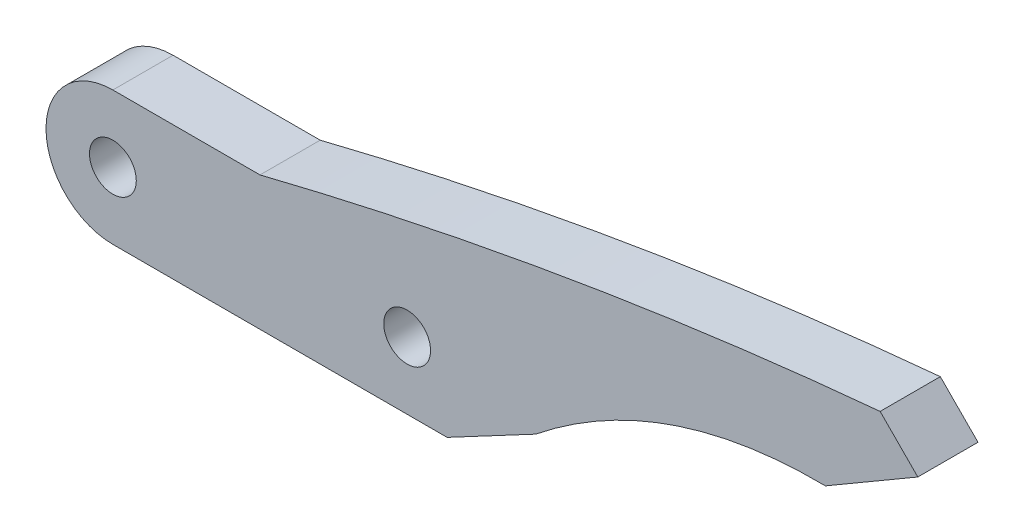
ISO-10303-21;
HEADER;
FILE_DESCRIPTION(('STEP AP214'),'2;1');
FILE_NAME('part.step','',(''),(''),'','','');
FILE_SCHEMA(('AUTOMOTIVE_DESIGN { 1 0 10303 214 1 1 1 1 }'));
ENDSEC;
DATA;
#1=APPLICATION_CONTEXT('core data for automotive mechanical design processes');
#2=APPLICATION_PROTOCOL_DEFINITION('international standard','automotive_design',2000,#1);
#3=PRODUCT_CONTEXT('',#1,'mechanical');
#4=PRODUCT('Part','Part','',(#3));
#5=PRODUCT_RELATED_PRODUCT_CATEGORY('part','',(#4));
#6=PRODUCT_DEFINITION_FORMATION('','',#4);
#7=PRODUCT_DEFINITION_CONTEXT('part definition',#1,'design');
#8=PRODUCT_DEFINITION('design','',#6,#7);
#9=PRODUCT_DEFINITION_SHAPE('','',#8);
#10=(LENGTH_UNIT() NAMED_UNIT(*) SI_UNIT(.MILLI.,.METRE.));
#11=(NAMED_UNIT(*) PLANE_ANGLE_UNIT() SI_UNIT($,.RADIAN.));
#12=(NAMED_UNIT(*) SI_UNIT($,.STERADIAN.) SOLID_ANGLE_UNIT());
#13=UNCERTAINTY_MEASURE_WITH_UNIT(LENGTH_MEASURE(1.E-05),#10,'distance_accuracy_value','');
#14=(GEOMETRIC_REPRESENTATION_CONTEXT(3) GLOBAL_UNCERTAINTY_ASSIGNED_CONTEXT((#13)) GLOBAL_UNIT_ASSIGNED_CONTEXT((#10,
#11,#12)) REPRESENTATION_CONTEXT('',''));
#15=CARTESIAN_POINT('',(0.,0.,0.));
#16=DIRECTION('',(0.,0.,1.));
#17=DIRECTION('',(1.,0.,0.));
#18=AXIS2_PLACEMENT_3D('',#15,#16,#17);
#19=CARTESIAN_POINT('',(-11.,0.,4.5));
#20=DIRECTION('',(0.,0.,-1.));
#21=DIRECTION('',(-1.,0.,0.));
#22=AXIS2_PLACEMENT_3D('',#19,#20,#21);
#23=CYLINDRICAL_SURFACE('',#22,5.);
#24=CARTESIAN_POINT('',(-11.,0.,0.));
#25=DIRECTION('',(0.,0.,1.));
#26=DIRECTION('',(1.,0.,0.));
#27=AXIS2_PLACEMENT_3D('',#24,#25,#26);
#28=CIRCLE('',#27,5.);
#29=CARTESIAN_POINT('',(-11.,5.,0.));
#30=VERTEX_POINT('',#29);
#31=CARTESIAN_POINT('',(-11.,-5.,0.));
#32=VERTEX_POINT('',#31);
#33=EDGE_CURVE('E85',#30,#32,#28,.T.);
#34=ORIENTED_EDGE('',*,*,#33,.T.);
#35=DIRECTION('',(0.,0.,-1.));
#36=VECTOR('',#35,1.);
#37=CARTESIAN_POINT('',(-11.,-5.,4.5));
#38=LINE('',#37,#36);
#39=CARTESIAN_POINT('',(-11.,-5.,4.5));
#40=VERTEX_POINT('',#39);
#41=EDGE_CURVE('E11',#40,#32,#38,.T.);
#42=ORIENTED_EDGE('',*,*,#41,.F.);
#43=CARTESIAN_POINT('',(-11.,0.,4.5));
#44=DIRECTION('',(0.,0.,1.));
#45=DIRECTION('',(1.,0.,0.));
#46=AXIS2_PLACEMENT_3D('',#43,#44,#45);
#47=CIRCLE('',#46,5.);
#48=CARTESIAN_POINT('',(-11.,5.,4.5));
#49=VERTEX_POINT('',#48);
#50=EDGE_CURVE('E84',#49,#40,#47,.T.);
#51=ORIENTED_EDGE('',*,*,#50,.F.);
#52=DIRECTION('',(0.,0.,-1.));
#53=VECTOR('',#52,1.);
#54=CARTESIAN_POINT('',(-11.,5.,4.5));
#55=LINE('',#54,#53);
#56=EDGE_CURVE('E57',#49,#30,#55,.T.);
#57=ORIENTED_EDGE('',*,*,#56,.T.);
#58=EDGE_LOOP('',(#34,#42,#51,#57));
#59=FACE_BOUND('',#58,.T.);
#60=ADVANCED_FACE('F50',(#59),#23,.T.);
#61=CARTESIAN_POINT('',(0.,-5.,4.5));
#62=DIRECTION('',(0.,1.,0.));
#63=DIRECTION('',(0.,0.,1.));
#64=AXIS2_PLACEMENT_3D('',#61,#62,#63);
#65=PLANE('',#64);
#66=DIRECTION('',(1.,0.,0.));
#67=VECTOR('',#66,1.);
#68=CARTESIAN_POINT('',(0.,-5.,0.));
#69=LINE('',#68,#67);
#70=CARTESIAN_POINT('',(13.99,-5.,0.));
#71=VERTEX_POINT('',#70);
#72=EDGE_CURVE('E96',#32,#71,#69,.T.);
#73=ORIENTED_EDGE('',*,*,#72,.T.);
#74=DIRECTION('',(0.,0.,1.));
#75=VECTOR('',#74,1.);
#76=CARTESIAN_POINT('',(13.99,-5.,-52.3267387246767));
#77=LINE('',#76,#75);
#78=CARTESIAN_POINT('',(13.99,-5.,4.5));
#79=VERTEX_POINT('',#78);
#80=EDGE_CURVE('E135',#71,#79,#77,.T.);
#81=ORIENTED_EDGE('',*,*,#80,.T.);
#82=DIRECTION('',(1.,0.,0.));
#83=VECTOR('',#82,1.);
#84=CARTESIAN_POINT('',(0.,-5.,4.5));
#85=LINE('',#84,#83);
#86=EDGE_CURVE('E123',#40,#79,#85,.T.);
#87=ORIENTED_EDGE('',*,*,#86,.F.);
#88=ORIENTED_EDGE('',*,*,#41,.T.);
#89=EDGE_LOOP('',(#73,#81,#87,#88));
#90=FACE_BOUND('',#89,.T.);
#91=ADVANCED_FACE('F223',(#90),#65,.F.);
#92=CARTESIAN_POINT('',(0.,5.,4.5));
#93=DIRECTION('',(0.,1.,0.));
#94=DIRECTION('',(0.,0.,1.));
#95=AXIS2_PLACEMENT_3D('',#92,#93,#94);
#96=PLANE('',#95);
#97=DIRECTION('',(0.,0.,1.));
#98=VECTOR('',#97,1.);
#99=CARTESIAN_POINT('',(0.,5.,-52.3267387246767));
#100=LINE('',#99,#98);
#101=CARTESIAN_POINT('',(0.,5.,0.));
#102=VERTEX_POINT('',#101);
#103=CARTESIAN_POINT('',(0.,5.,4.5));
#104=VERTEX_POINT('',#103);
#105=EDGE_CURVE('E61',#102,#104,#100,.T.);
#106=ORIENTED_EDGE('',*,*,#105,.F.);
#107=DIRECTION('',(1.,0.,0.));
#108=VECTOR('',#107,1.);
#109=CARTESIAN_POINT('',(0.,5.,0.));
#110=LINE('',#109,#108);
#111=EDGE_CURVE('E93',#30,#102,#110,.T.);
#112=ORIENTED_EDGE('',*,*,#111,.F.);
#113=ORIENTED_EDGE('',*,*,#56,.F.);
#114=DIRECTION('',(1.,0.,0.));
#115=VECTOR('',#114,1.);
#116=CARTESIAN_POINT('',(0.,5.,4.5));
#117=LINE('',#116,#115);
#118=EDGE_CURVE('E116',#49,#104,#117,.T.);
#119=ORIENTED_EDGE('',*,*,#118,.T.);
#120=EDGE_LOOP('',(#106,#112,#113,#119));
#121=FACE_BOUND('',#120,.T.);
#122=ADVANCED_FACE('F99',(#121),#96,.T.);
#123=CARTESIAN_POINT('',(-11.,0.,4.5));
#124=DIRECTION('',(0.,0.,-1.));
#125=DIRECTION('',(-1.,0.,0.));
#126=AXIS2_PLACEMENT_3D('',#123,#124,#125);
#127=CYLINDRICAL_SURFACE('',#126,1.75);
#128=CARTESIAN_POINT('',(-11.,0.,4.5));
#129=DIRECTION('',(0.,0.,1.));
#130=DIRECTION('',(1.,0.,0.));
#131=AXIS2_PLACEMENT_3D('',#128,#129,#130);
#132=CIRCLE('',#131,1.75);
#133=CARTESIAN_POINT('',(-9.25,0.,4.5));
#134=VERTEX_POINT('',#133);
#135=EDGE_CURVE('E110',#134,#134,#132,.T.);
#136=ORIENTED_EDGE('',*,*,#135,.T.);
#137=EDGE_LOOP('',(#136));
#138=FACE_BOUND('',#137,.T.);
#139=CARTESIAN_POINT('',(-11.,0.,0.));
#140=DIRECTION('',(0.,0.,1.));
#141=DIRECTION('',(1.,0.,0.));
#142=AXIS2_PLACEMENT_3D('',#139,#140,#141);
#143=CIRCLE('',#142,1.75);
#144=CARTESIAN_POINT('',(-9.25,0.,0.));
#145=VERTEX_POINT('',#144);
#146=EDGE_CURVE('E97',#145,#145,#143,.T.);
#147=ORIENTED_EDGE('',*,*,#146,.F.);
#148=EDGE_LOOP('',(#147));
#149=FACE_BOUND('',#148,.T.);
#150=ADVANCED_FACE('F47',(#138,#149),#127,.F.);
#151=CARTESIAN_POINT('',(11.,0.,4.5));
#152=DIRECTION('',(0.,0.,-1.));
#153=DIRECTION('',(-1.,0.,0.));
#154=AXIS2_PLACEMENT_3D('',#151,#152,#153);
#155=CYLINDRICAL_SURFACE('',#154,1.75);
#156=CARTESIAN_POINT('',(11.,0.,4.5));
#157=DIRECTION('',(0.,0.,1.));
#158=DIRECTION('',(1.,0.,0.));
#159=AXIS2_PLACEMENT_3D('',#156,#157,#158);
#160=CIRCLE('',#159,1.75);
#161=CARTESIAN_POINT('',(12.75,0.,4.5));
#162=VERTEX_POINT('',#161);
#163=EDGE_CURVE('E90',#162,#162,#160,.F.);
#164=ORIENTED_EDGE('',*,*,#163,.F.);
#165=EDGE_LOOP('',(#164));
#166=FACE_BOUND('',#165,.T.);
#167=CARTESIAN_POINT('',(11.,0.,0.));
#168=DIRECTION('',(0.,0.,1.));
#169=DIRECTION('',(1.,0.,0.));
#170=AXIS2_PLACEMENT_3D('',#167,#168,#169);
#171=CIRCLE('',#170,1.75);
#172=CARTESIAN_POINT('',(12.75,0.,0.));
#173=VERTEX_POINT('',#172);
#174=EDGE_CURVE('E105',#173,#173,#171,.F.);
#175=ORIENTED_EDGE('',*,*,#174,.T.);
#176=EDGE_LOOP('',(#175));
#177=FACE_BOUND('',#176,.T.);
#178=ADVANCED_FACE('F215',(#166,#177),#155,.F.);
#179=CARTESIAN_POINT('',(0.,0.,4.5));
#180=DIRECTION('',(0.,0.,1.));
#181=DIRECTION('',(1.,0.,0.));
#182=AXIS2_PLACEMENT_3D('',#179,#180,#181);
#183=PLANE('',#182);
#184=ORIENTED_EDGE('',*,*,#86,.T.);
#185=DIRECTION('',(0.882942972945771,0.469480251475697,0.));
#186=VECTOR('',#185,1.);
#187=CARTESIAN_POINT('',(20.61,-1.48,4.5));
#188=LINE('',#187,#186);
#189=CARTESIAN_POINT('',(20.61,-1.48,4.5));
#190=VERTEX_POINT('',#189);
#191=EDGE_CURVE('E167',#79,#190,#188,.T.);
#192=ORIENTED_EDGE('',*,*,#191,.T.);
#193=CARTESIAN_POINT('',(20.61,-1.48,4.5));
#194=CARTESIAN_POINT('',(30.1461507480521,6.15734830451268,4.5));
#195=CARTESIAN_POINT('',(42.27,6.,4.5));
#196=B_SPLINE_CURVE_WITH_KNOTS('',2,(#193,#194,#195),.UNSPECIFIED.,.F.,.F.,(3,3),(0.,1.),.UNSPECIFIED.);
#197=CARTESIAN_POINT('',(42.27,6.,4.5));
#198=VERTEX_POINT('',#197);
#199=EDGE_CURVE('E163',#190,#198,#196,.T.);
#200=ORIENTED_EDGE('',*,*,#199,.T.);
#201=DIRECTION('',(0.863849487758139,0.50375,0.));
#202=VECTOR('',#201,1.);
#203=CARTESIAN_POINT('',(49.1807959020651,10.03,4.5));
#204=LINE('',#203,#202);
#205=CARTESIAN_POINT('',(49.1807959020651,10.03,4.5));
#206=VERTEX_POINT('',#205);
#207=EDGE_CURVE('E160',#198,#206,#204,.T.);
#208=ORIENTED_EDGE('',*,*,#207,.T.);
#209=DIRECTION('',(-0.70420167565833,0.71,0.));
#210=VECTOR('',#209,1.);
#211=CARTESIAN_POINT('',(46.3639891994318,12.87,4.5));
#212=LINE('',#211,#210);
#213=CARTESIAN_POINT('',(46.3639891994318,12.87,4.5));
#214=VERTEX_POINT('',#213);
#215=EDGE_CURVE('E133',#206,#214,#212,.T.);
#216=ORIENTED_EDGE('',*,*,#215,.T.);
#217=CARTESIAN_POINT('',(46.3639891994318,12.87,4.5));
#218=CARTESIAN_POINT('',(22.8855175011126,10.7079266509718,4.5));
#219=CARTESIAN_POINT('',(0.,5.,4.5));
#220=B_SPLINE_CURVE_WITH_KNOTS('',2,(#217,#218,#219),.UNSPECIFIED.,.F.,.F.,(3,3),(0.,1.),.UNSPECIFIED.);
#221=EDGE_CURVE('E174',#214,#104,#220,.T.);
#222=ORIENTED_EDGE('',*,*,#221,.T.);
#223=ORIENTED_EDGE('',*,*,#118,.F.);
#224=ORIENTED_EDGE('',*,*,#50,.T.);
#225=EDGE_LOOP('',(#184,#192,#200,#208,#216,#222,#223,#224));
#226=FACE_BOUND('',#225,.T.);
#227=ORIENTED_EDGE('',*,*,#135,.F.);
#228=EDGE_LOOP('',(#227));
#229=FACE_BOUND('',#228,.T.);
#230=ORIENTED_EDGE('',*,*,#163,.T.);
#231=EDGE_LOOP('',(#230));
#232=FACE_BOUND('',#231,.T.);
#233=ADVANCED_FACE('F213',(#226,#229,#232),#183,.T.);
#234=CARTESIAN_POINT('',(0.,0.,0.));
#235=DIRECTION('',(0.,0.,1.));
#236=DIRECTION('',(1.,0.,0.));
#237=AXIS2_PLACEMENT_3D('',#234,#235,#236);
#238=PLANE('',#237);
#239=DIRECTION('',(-0.882942972945771,-0.469480251475697,0.));
#240=VECTOR('',#239,1.);
#241=CARTESIAN_POINT('',(20.61,-1.48,0.));
#242=LINE('',#241,#240);
#243=CARTESIAN_POINT('',(20.61,-1.48,0.));
#244=VERTEX_POINT('',#243);
#245=EDGE_CURVE('E151',#244,#71,#242,.T.);
#246=ORIENTED_EDGE('',*,*,#245,.T.);
#247=ORIENTED_EDGE('',*,*,#72,.F.);
#248=ORIENTED_EDGE('',*,*,#33,.F.);
#249=ORIENTED_EDGE('',*,*,#111,.T.);
#250=CARTESIAN_POINT('',(46.3639891994318,12.87,0.));
#251=CARTESIAN_POINT('',(22.8855175011126,10.7079266509718,0.));
#252=CARTESIAN_POINT('',(0.,5.,0.));
#253=B_SPLINE_CURVE_WITH_KNOTS('',2,(#250,#251,#252),.UNSPECIFIED.,.F.,.F.,(3,3),(0.,1.),.UNSPECIFIED.);
#254=CARTESIAN_POINT('',(46.3639891994318,12.87,0.));
#255=VERTEX_POINT('',#254);
#256=EDGE_CURVE('E114',#102,#255,#253,.F.);
#257=ORIENTED_EDGE('',*,*,#256,.T.);
#258=DIRECTION('',(0.70420167565833,-0.71,0.));
#259=VECTOR('',#258,1.);
#260=CARTESIAN_POINT('',(46.3639891994318,12.87,0.));
#261=LINE('',#260,#259);
#262=CARTESIAN_POINT('',(49.1807959020651,10.03,0.));
#263=VERTEX_POINT('',#262);
#264=EDGE_CURVE('E343',#255,#263,#261,.T.);
#265=ORIENTED_EDGE('',*,*,#264,.T.);
#266=DIRECTION('',(-0.863849487758139,-0.50375,0.));
#267=VECTOR('',#266,1.);
#268=CARTESIAN_POINT('',(49.1807959020651,10.03,0.));
#269=LINE('',#268,#267);
#270=CARTESIAN_POINT('',(42.27,6.,0.));
#271=VERTEX_POINT('',#270);
#272=EDGE_CURVE('E328',#263,#271,#269,.T.);
#273=ORIENTED_EDGE('',*,*,#272,.T.);
#274=CARTESIAN_POINT('',(20.61,-1.48,0.));
#275=CARTESIAN_POINT('',(30.1461507480521,6.15734830451268,0.));
#276=CARTESIAN_POINT('',(42.27,6.,0.));
#277=B_SPLINE_CURVE_WITH_KNOTS('',2,(#274,#275,#276),.UNSPECIFIED.,.F.,.F.,(3,3),(0.,1.),.UNSPECIFIED.);
#278=EDGE_CURVE('E345',#271,#244,#277,.F.);
#279=ORIENTED_EDGE('',*,*,#278,.T.);
#280=EDGE_LOOP('',(#246,#247,#248,#249,#257,#265,#273,#279));
#281=FACE_BOUND('',#280,.T.);
#282=ORIENTED_EDGE('',*,*,#146,.T.);
#283=EDGE_LOOP('',(#282));
#284=FACE_BOUND('',#283,.T.);
#285=ORIENTED_EDGE('',*,*,#174,.F.);
#286=EDGE_LOOP('',(#285));
#287=FACE_BOUND('',#286,.T.);
#288=ADVANCED_FACE('F89',(#281,#284,#287),#238,.F.);
#289=CARTESIAN_POINT('',(46.3639891994318,12.87,-52.3267387246767));
#290=CARTESIAN_POINT('',(22.8855175011126,10.7079266509718,-52.3267387246767));
#291=CARTESIAN_POINT('',(0.,5.,-52.3267387246767));
#292=B_SPLINE_CURVE_WITH_KNOTS('',2,(#289,#290,#291),.UNSPECIFIED.,.F.,.F.,(3,3),(0.,1.),.UNSPECIFIED.);
#293=DIRECTION('',(0.,0.,1.));
#294=VECTOR('',#293,1.);
#295=SURFACE_OF_LINEAR_EXTRUSION('',#292,#294);
#296=ORIENTED_EDGE('',*,*,#256,.F.);
#297=ORIENTED_EDGE('',*,*,#105,.T.);
#298=ORIENTED_EDGE('',*,*,#221,.F.);
#299=DIRECTION('',(0.,0.,1.));
#300=VECTOR('',#299,1.);
#301=CARTESIAN_POINT('',(46.3639891994318,12.87,-52.3267387246767));
#302=LINE('',#301,#300);
#303=EDGE_CURVE('E146',#255,#214,#302,.T.);
#304=ORIENTED_EDGE('',*,*,#303,.F.);
#305=EDGE_LOOP('',(#296,#297,#298,#304));
#306=FACE_BOUND('',#305,.T.);
#307=ADVANCED_FACE('F208',(#306),#295,.T.);
#308=CARTESIAN_POINT('',(46.3639891994318,12.87,-52.3267387246767));
#309=DIRECTION('',(0.71,0.70420167565833,0.));
#310=DIRECTION('',(-0.70420167565833,0.71,0.));
#311=AXIS2_PLACEMENT_3D('',#308,#309,#310);
#312=PLANE('',#311);
#313=ORIENTED_EDGE('',*,*,#264,.F.);
#314=ORIENTED_EDGE('',*,*,#303,.T.);
#315=ORIENTED_EDGE('',*,*,#215,.F.);
#316=DIRECTION('',(0.,0.,1.));
#317=VECTOR('',#316,1.);
#318=CARTESIAN_POINT('',(49.1807959020651,10.03,-52.3267387246767));
#319=LINE('',#318,#317);
#320=EDGE_CURVE('E144',#263,#206,#319,.T.);
#321=ORIENTED_EDGE('',*,*,#320,.F.);
#322=EDGE_LOOP('',(#313,#314,#315,#321));
#323=FACE_BOUND('',#322,.T.);
#324=ADVANCED_FACE('F207',(#323),#312,.T.);
#325=CARTESIAN_POINT('',(49.1807959020651,10.03,-52.3267387246767));
#326=DIRECTION('',(0.50375,-0.863849487758139,0.));
#327=DIRECTION('',(0.863849487758139,0.50375,0.));
#328=AXIS2_PLACEMENT_3D('',#325,#326,#327);
#329=PLANE('',#328);
#330=ORIENTED_EDGE('',*,*,#272,.F.);
#331=ORIENTED_EDGE('',*,*,#320,.T.);
#332=ORIENTED_EDGE('',*,*,#207,.F.);
#333=DIRECTION('',(0.,0.,1.));
#334=VECTOR('',#333,1.);
#335=CARTESIAN_POINT('',(42.27,6.,-52.3267387246767));
#336=LINE('',#335,#334);
#337=EDGE_CURVE('E141',#271,#198,#336,.T.);
#338=ORIENTED_EDGE('',*,*,#337,.F.);
#339=EDGE_LOOP('',(#330,#331,#332,#338));
#340=FACE_BOUND('',#339,.T.);
#341=ADVANCED_FACE('F199',(#340),#329,.T.);
#342=CARTESIAN_POINT('',(20.61,-1.48,-52.3267387246767));
#343=CARTESIAN_POINT('',(30.1461507480521,6.15734830451268,-52.3267387246767));
#344=CARTESIAN_POINT('',(42.27,6.,-52.3267387246767));
#345=B_SPLINE_CURVE_WITH_KNOTS('',2,(#342,#343,#344),.UNSPECIFIED.,.F.,.F.,(3,3),(0.,1.),.UNSPECIFIED.);
#346=DIRECTION('',(0.,0.,1.));
#347=VECTOR('',#346,1.);
#348=SURFACE_OF_LINEAR_EXTRUSION('',#345,#347);
#349=ORIENTED_EDGE('',*,*,#278,.F.);
#350=ORIENTED_EDGE('',*,*,#337,.T.);
#351=ORIENTED_EDGE('',*,*,#199,.F.);
#352=DIRECTION('',(0.,0.,1.));
#353=VECTOR('',#352,1.);
#354=CARTESIAN_POINT('',(20.61,-1.48,-52.3267387246767));
#355=LINE('',#354,#353);
#356=EDGE_CURVE('E140',#244,#190,#355,.T.);
#357=ORIENTED_EDGE('',*,*,#356,.F.);
#358=EDGE_LOOP('',(#349,#350,#351,#357));
#359=FACE_BOUND('',#358,.T.);
#360=ADVANCED_FACE('F193',(#359),#348,.T.);
#361=CARTESIAN_POINT('',(20.61,-1.48,-52.3267387246767));
#362=DIRECTION('',(0.469480251475697,-0.882942972945771,0.));
#363=DIRECTION('',(0.882942972945771,0.469480251475697,0.));
#364=AXIS2_PLACEMENT_3D('',#361,#362,#363);
#365=PLANE('',#364);
#366=ORIENTED_EDGE('',*,*,#245,.F.);
#367=ORIENTED_EDGE('',*,*,#356,.T.);
#368=ORIENTED_EDGE('',*,*,#191,.F.);
#369=ORIENTED_EDGE('',*,*,#80,.F.);
#370=EDGE_LOOP('',(#366,#367,#368,#369));
#371=FACE_BOUND('',#370,.T.);
#372=ADVANCED_FACE('F197',(#371),#365,.T.);
#373=CLOSED_SHELL('',(#60,#91,#122,#150,#178,#233,#288,#307,#324,#341,#360,#372));
#374=MANIFOLD_SOLID_BREP('B2',#373);
#375=ADVANCED_BREP_SHAPE_REPRESENTATION('',(#18,#374),#14);
#376=SHAPE_DEFINITION_REPRESENTATION(#9,#375);
ENDSEC;
END-ISO-10303-21;
